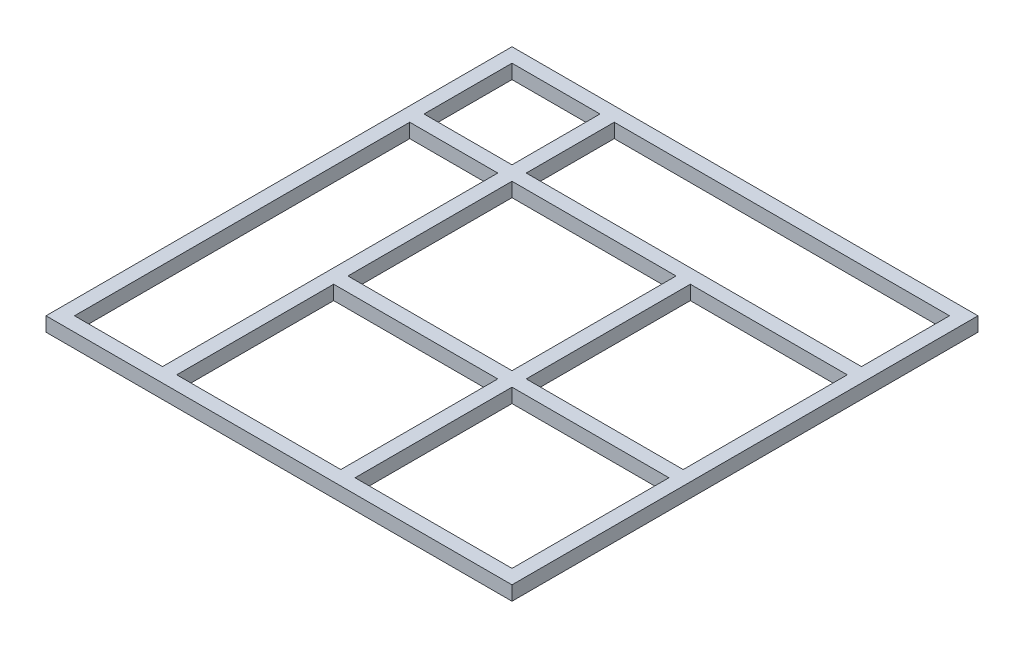
ISO-10303-21;
HEADER;
FILE_DESCRIPTION(('STEP AP214'),'2;1');
FILE_NAME('part.step','',(''),(''),'','','');
FILE_SCHEMA(('AUTOMOTIVE_DESIGN { 1 0 10303 214 1 1 1 1 }'));
ENDSEC;
DATA;
#1=APPLICATION_CONTEXT('core data for automotive mechanical design processes');
#2=APPLICATION_PROTOCOL_DEFINITION('international standard','automotive_design',2000,#1);
#3=PRODUCT_CONTEXT('',#1,'mechanical');
#4=PRODUCT('Part','Part','',(#3));
#5=PRODUCT_RELATED_PRODUCT_CATEGORY('part','',(#4));
#6=PRODUCT_DEFINITION_FORMATION('','',#4);
#7=PRODUCT_DEFINITION_CONTEXT('part definition',#1,'design');
#8=PRODUCT_DEFINITION('design','',#6,#7);
#9=PRODUCT_DEFINITION_SHAPE('','',#8);
#10=(LENGTH_UNIT() NAMED_UNIT(*) SI_UNIT(.MILLI.,.METRE.));
#11=(NAMED_UNIT(*) PLANE_ANGLE_UNIT() SI_UNIT($,.RADIAN.));
#12=(NAMED_UNIT(*) SI_UNIT($,.STERADIAN.) SOLID_ANGLE_UNIT());
#13=UNCERTAINTY_MEASURE_WITH_UNIT(LENGTH_MEASURE(1.E-05),#10,'distance_accuracy_value','');
#14=(GEOMETRIC_REPRESENTATION_CONTEXT(3) GLOBAL_UNCERTAINTY_ASSIGNED_CONTEXT((#13)) GLOBAL_UNIT_ASSIGNED_CONTEXT((#10,
#11,#12)) REPRESENTATION_CONTEXT('',''));
#15=CARTESIAN_POINT('',(0.,0.,0.));
#16=DIRECTION('',(0.,0.,1.));
#17=DIRECTION('',(1.,0.,0.));
#18=AXIS2_PLACEMENT_3D('',#15,#16,#17);
#19=CARTESIAN_POINT('',(0.,13.022,0.));
#20=DIRECTION('',(0.,-1.,0.));
#21=DIRECTION('',(0.,0.,-1.));
#22=AXIS2_PLACEMENT_3D('',#19,#20,#21);
#23=PLANE('',#22);
#24=DIRECTION('',(0.,0.,-1.));
#25=VECTOR('',#24,1.);
#26=CARTESIAN_POINT('',(413.022,13.022,-169.533));
#27=LINE('',#26,#25);
#28=CARTESIAN_POINT('',(413.022,13.022,-169.533));
#29=VERTEX_POINT('',#28);
#30=CARTESIAN_POINT('',(413.022,13.022,-319.533));
#31=VERTEX_POINT('',#30);
#32=EDGE_CURVE('E281',#29,#31,#27,.T.);
#33=ORIENTED_EDGE('',*,*,#32,.F.);
#34=DIRECTION('',(1.,0.,0.));
#35=VECTOR('',#34,1.);
#36=CARTESIAN_POINT('',(269.533,13.022,-169.533));
#37=LINE('',#36,#35);
#38=CARTESIAN_POINT('',(269.533,13.022,-169.533));
#39=VERTEX_POINT('',#38);
#40=EDGE_CURVE('E289',#39,#29,#37,.T.);
#41=ORIENTED_EDGE('',*,*,#40,.F.);
#42=DIRECTION('',(0.,0.,1.));
#43=VECTOR('',#42,1.);
#44=CARTESIAN_POINT('',(269.533,13.022,-319.533));
#45=LINE('',#44,#43);
#46=CARTESIAN_POINT('',(269.533,13.022,-319.533));
#47=VERTEX_POINT('',#46);
#48=EDGE_CURVE('E286',#47,#39,#45,.T.);
#49=ORIENTED_EDGE('',*,*,#48,.F.);
#50=DIRECTION('',(-1.,0.,0.));
#51=VECTOR('',#50,1.);
#52=CARTESIAN_POINT('',(269.533,13.022,-319.533));
#53=LINE('',#52,#51);
#54=EDGE_CURVE('E283',#31,#47,#53,.T.);
#55=ORIENTED_EDGE('',*,*,#54,.F.);
#56=EDGE_LOOP('',(#33,#41,#49,#55));
#57=FACE_BOUND('',#56,.T.);
#58=DIRECTION('',(1.,0.,0.));
#59=VECTOR('',#58,1.);
#60=CARTESIAN_POINT('',(269.533,13.022,-13.022));
#61=LINE('',#60,#59);
#62=CARTESIAN_POINT('',(269.533,13.022,-13.022));
#63=VERTEX_POINT('',#62);
#64=CARTESIAN_POINT('',(413.022,13.022,-13.022));
#65=VERTEX_POINT('',#64);
#66=EDGE_CURVE('E343',#63,#65,#61,.T.);
#67=ORIENTED_EDGE('',*,*,#66,.F.);
#68=DIRECTION('',(0.,0.,1.));
#69=VECTOR('',#68,1.);
#70=CARTESIAN_POINT('',(269.533,13.022,-156.511));
#71=LINE('',#70,#69);
#72=CARTESIAN_POINT('',(269.533,13.022,-156.511));
#73=VERTEX_POINT('',#72);
#74=EDGE_CURVE('E351',#73,#63,#71,.T.);
#75=ORIENTED_EDGE('',*,*,#74,.F.);
#76=DIRECTION('',(-1.,0.,0.));
#77=VECTOR('',#76,1.);
#78=CARTESIAN_POINT('',(269.533,13.022,-156.511));
#79=LINE('',#78,#77);
#80=CARTESIAN_POINT('',(413.022,13.022,-156.511));
#81=VERTEX_POINT('',#80);
#82=EDGE_CURVE('E348',#81,#73,#79,.T.);
#83=ORIENTED_EDGE('',*,*,#82,.F.);
#84=DIRECTION('',(0.,0.,-1.));
#85=VECTOR('',#84,1.);
#86=CARTESIAN_POINT('',(413.022,13.022,-13.022));
#87=LINE('',#86,#85);
#88=EDGE_CURVE('E345',#65,#81,#87,.T.);
#89=ORIENTED_EDGE('',*,*,#88,.F.);
#90=EDGE_LOOP('',(#67,#75,#83,#89));
#91=FACE_BOUND('',#90,.T.);
#92=DIRECTION('',(0.,0.,-1.));
#93=VECTOR('',#92,1.);
#94=CARTESIAN_POINT('',(413.022,13.022,-332.555));
#95=LINE('',#94,#93);
#96=CARTESIAN_POINT('',(413.022,13.022,-332.555));
#97=VERTEX_POINT('',#96);
#98=CARTESIAN_POINT('',(413.022,13.022,-413.022));
#99=VERTEX_POINT('',#98);
#100=EDGE_CURVE('E405',#97,#99,#95,.T.);
#101=ORIENTED_EDGE('',*,*,#100,.F.);
#102=DIRECTION('',(1.,0.,0.));
#103=VECTOR('',#102,1.);
#104=CARTESIAN_POINT('',(106.511,13.022,-332.555));
#105=LINE('',#104,#103);
#106=CARTESIAN_POINT('',(106.511,13.022,-332.555));
#107=VERTEX_POINT('',#106);
#108=EDGE_CURVE('E413',#107,#97,#105,.T.);
#109=ORIENTED_EDGE('',*,*,#108,.F.);
#110=DIRECTION('',(0.,0.,1.));
#111=VECTOR('',#110,1.);
#112=CARTESIAN_POINT('',(106.511,13.022,-413.022));
#113=LINE('',#112,#111);
#114=CARTESIAN_POINT('',(106.511,13.022,-413.022));
#115=VERTEX_POINT('',#114);
#116=EDGE_CURVE('E410',#115,#107,#113,.T.);
#117=ORIENTED_EDGE('',*,*,#116,.F.);
#118=DIRECTION('',(-1.,0.,0.));
#119=VECTOR('',#118,1.);
#120=CARTESIAN_POINT('',(106.511,13.022,-413.022));
#121=LINE('',#120,#119);
#122=EDGE_CURVE('E407',#99,#115,#121,.T.);
#123=ORIENTED_EDGE('',*,*,#122,.F.);
#124=EDGE_LOOP('',(#101,#109,#117,#123));
#125=FACE_BOUND('',#124,.T.);
#126=DIRECTION('',(0.,0.,1.));
#127=VECTOR('',#126,1.);
#128=CARTESIAN_POINT('',(0.,13.022,0.));
#129=LINE('',#128,#127);
#130=CARTESIAN_POINT('',(0.,13.022,-426.044));
#131=VERTEX_POINT('',#130);
#132=CARTESIAN_POINT('',(0.,13.022,0.));
#133=VERTEX_POINT('',#132);
#134=EDGE_CURVE('E467',#131,#133,#129,.T.);
#135=ORIENTED_EDGE('',*,*,#134,.T.);
#136=DIRECTION('',(1.,0.,0.));
#137=VECTOR('',#136,1.);
#138=CARTESIAN_POINT('',(0.,13.022,0.));
#139=LINE('',#138,#137);
#140=CARTESIAN_POINT('',(426.044,13.022,0.));
#141=VERTEX_POINT('',#140);
#142=EDGE_CURVE('E470',#133,#141,#139,.T.);
#143=ORIENTED_EDGE('',*,*,#142,.T.);
#144=DIRECTION('',(0.,0.,-1.));
#145=VECTOR('',#144,1.);
#146=CARTESIAN_POINT('',(426.044,13.022,0.));
#147=LINE('',#146,#145);
#148=CARTESIAN_POINT('',(426.044,13.022,-426.044));
#149=VERTEX_POINT('',#148);
#150=EDGE_CURVE('E473',#141,#149,#147,.T.);
#151=ORIENTED_EDGE('',*,*,#150,.T.);
#152=DIRECTION('',(-1.,0.,0.));
#153=VECTOR('',#152,1.);
#154=CARTESIAN_POINT('',(0.,13.022,-426.044));
#155=LINE('',#154,#153);
#156=EDGE_CURVE('E475',#149,#131,#155,.T.);
#157=ORIENTED_EDGE('',*,*,#156,.T.);
#158=EDGE_LOOP('',(#135,#143,#151,#157));
#159=FACE_BOUND('',#158,.T.);
#160=DIRECTION('',(0.,0.,1.));
#161=VECTOR('',#160,1.);
#162=CARTESIAN_POINT('',(13.0219999999999,13.022,-13.022));
#163=LINE('',#162,#161);
#164=CARTESIAN_POINT('',(13.0219999999999,13.022,-319.533));
#165=VERTEX_POINT('',#164);
#166=CARTESIAN_POINT('',(13.0219999999999,13.022,-13.022));
#167=VERTEX_POINT('',#166);
#168=EDGE_CURVE('E436',#165,#167,#163,.T.);
#169=ORIENTED_EDGE('',*,*,#168,.F.);
#170=DIRECTION('',(-1.,0.,0.));
#171=VECTOR('',#170,1.);
#172=CARTESIAN_POINT('',(13.0219999999999,13.022,-319.533));
#173=LINE('',#172,#171);
#174=CARTESIAN_POINT('',(93.4890000000026,13.022,-319.533));
#175=VERTEX_POINT('',#174);
#176=EDGE_CURVE('E444',#175,#165,#173,.T.);
#177=ORIENTED_EDGE('',*,*,#176,.F.);
#178=DIRECTION('',(0.,0.,-1.));
#179=VECTOR('',#178,1.);
#180=CARTESIAN_POINT('',(93.4890000000026,13.022,-319.533));
#181=LINE('',#180,#179);
#182=CARTESIAN_POINT('',(93.489,13.022,-13.022));
#183=VERTEX_POINT('',#182);
#184=EDGE_CURVE('E441',#183,#175,#181,.T.);
#185=ORIENTED_EDGE('',*,*,#184,.F.);
#186=DIRECTION('',(1.,0.,0.));
#187=VECTOR('',#186,1.);
#188=CARTESIAN_POINT('',(13.0219999999999,13.022,-13.022));
#189=LINE('',#188,#187);
#190=EDGE_CURVE('E438',#167,#183,#189,.T.);
#191=ORIENTED_EDGE('',*,*,#190,.F.);
#192=EDGE_LOOP('',(#169,#177,#185,#191));
#193=FACE_BOUND('',#192,.T.);
#194=DIRECTION('',(0.,0.,1.));
#195=VECTOR('',#194,1.);
#196=CARTESIAN_POINT('',(13.0219999999999,13.022,-332.555));
#197=LINE('',#196,#195);
#198=CARTESIAN_POINT('',(13.0219999999999,13.022,-413.022));
#199=VERTEX_POINT('',#198);
#200=CARTESIAN_POINT('',(13.0219999999999,13.022,-332.555));
#201=VERTEX_POINT('',#200);
#202=EDGE_CURVE('E374',#199,#201,#197,.T.);
#203=ORIENTED_EDGE('',*,*,#202,.F.);
#204=DIRECTION('',(-1.,0.,0.));
#205=VECTOR('',#204,1.);
#206=CARTESIAN_POINT('',(13.0219999999999,13.022,-413.022));
#207=LINE('',#206,#205);
#208=CARTESIAN_POINT('',(93.489,13.022,-413.022));
#209=VERTEX_POINT('',#208);
#210=EDGE_CURVE('E382',#209,#199,#207,.T.);
#211=ORIENTED_EDGE('',*,*,#210,.F.);
#212=DIRECTION('',(0.,0.,-1.));
#213=VECTOR('',#212,1.);
#214=CARTESIAN_POINT('',(93.489,13.022,-413.022));
#215=LINE('',#214,#213);
#216=CARTESIAN_POINT('',(93.489,13.022,-332.555));
#217=VERTEX_POINT('',#216);
#218=EDGE_CURVE('E379',#217,#209,#215,.T.);
#219=ORIENTED_EDGE('',*,*,#218,.F.);
#220=DIRECTION('',(1.,0.,0.));
#221=VECTOR('',#220,1.);
#222=CARTESIAN_POINT('',(13.0219999999999,13.022,-332.555));
#223=LINE('',#222,#221);
#224=EDGE_CURVE('E376',#201,#217,#223,.T.);
#225=ORIENTED_EDGE('',*,*,#224,.F.);
#226=EDGE_LOOP('',(#203,#211,#219,#225));
#227=FACE_BOUND('',#226,.T.);
#228=DIRECTION('',(0.,0.,1.));
#229=VECTOR('',#228,1.);
#230=CARTESIAN_POINT('',(106.511,13.022,-156.511));
#231=LINE('',#230,#229);
#232=CARTESIAN_POINT('',(106.511,13.022,-156.511));
#233=VERTEX_POINT('',#232);
#234=CARTESIAN_POINT('',(106.511,13.022,-13.022));
#235=VERTEX_POINT('',#234);
#236=EDGE_CURVE('E312',#233,#235,#231,.T.);
#237=ORIENTED_EDGE('',*,*,#236,.F.);
#238=DIRECTION('',(-1.,0.,0.));
#239=VECTOR('',#238,1.);
#240=CARTESIAN_POINT('',(106.511,13.022,-156.511));
#241=LINE('',#240,#239);
#242=CARTESIAN_POINT('',(256.511,13.022,-156.511));
#243=VERTEX_POINT('',#242);
#244=EDGE_CURVE('E320',#243,#233,#241,.T.);
#245=ORIENTED_EDGE('',*,*,#244,.F.);
#246=DIRECTION('',(0.,0.,-1.));
#247=VECTOR('',#246,1.);
#248=CARTESIAN_POINT('',(256.511,13.022,-156.511));
#249=LINE('',#248,#247);
#250=CARTESIAN_POINT('',(256.511,13.022,-13.022));
#251=VERTEX_POINT('',#250);
#252=EDGE_CURVE('E317',#251,#243,#249,.T.);
#253=ORIENTED_EDGE('',*,*,#252,.F.);
#254=DIRECTION('',(1.,0.,0.));
#255=VECTOR('',#254,1.);
#256=CARTESIAN_POINT('',(106.511,13.022,-13.022));
#257=LINE('',#256,#255);
#258=EDGE_CURVE('E314',#235,#251,#257,.T.);
#259=ORIENTED_EDGE('',*,*,#258,.F.);
#260=EDGE_LOOP('',(#237,#245,#253,#259));
#261=FACE_BOUND('',#260,.T.);
#262=DIRECTION('',(0.,0.,-1.));
#263=VECTOR('',#262,1.);
#264=CARTESIAN_POINT('',(256.511,13.022,-319.533));
#265=LINE('',#264,#263);
#266=CARTESIAN_POINT('',(256.511,13.022,-169.533));
#267=VERTEX_POINT('',#266);
#268=CARTESIAN_POINT('',(256.511,13.022,-319.533));
#269=VERTEX_POINT('',#268);
#270=EDGE_CURVE('E245',#267,#269,#265,.T.);
#271=ORIENTED_EDGE('',*,*,#270,.F.);
#272=DIRECTION('',(1.,0.,0.));
#273=VECTOR('',#272,1.);
#274=CARTESIAN_POINT('',(106.511,13.022,-169.533));
#275=LINE('',#274,#273);
#276=CARTESIAN_POINT('',(106.511,13.022,-169.533));
#277=VERTEX_POINT('',#276);
#278=EDGE_CURVE('E267',#277,#267,#275,.T.);
#279=ORIENTED_EDGE('',*,*,#278,.F.);
#280=DIRECTION('',(0.,0.,1.));
#281=VECTOR('',#280,1.);
#282=CARTESIAN_POINT('',(106.511,13.022,-319.533000000003));
#283=LINE('',#282,#281);
#284=CARTESIAN_POINT('',(106.511,13.022,-319.533000000003));
#285=VERTEX_POINT('',#284);
#286=EDGE_CURVE('E265',#285,#277,#283,.T.);
#287=ORIENTED_EDGE('',*,*,#286,.F.);
#288=DIRECTION('',(-1.,0.,0.));
#289=VECTOR('',#288,1.);
#290=CARTESIAN_POINT('',(106.511,13.022,-319.533000000003));
#291=LINE('',#290,#289);
#292=EDGE_CURVE('E253',#269,#285,#291,.T.);
#293=ORIENTED_EDGE('',*,*,#292,.F.);
#294=EDGE_LOOP('',(#271,#279,#287,#293));
#295=FACE_BOUND('',#294,.T.);
#296=ADVANCED_FACE('F36',(#57,#91,#125,#159,#193,#227,#261,#295),#23,.F.);
#297=CARTESIAN_POINT('',(0.,0.,0.));
#298=DIRECTION('',(0.,-1.,0.));
#299=DIRECTION('',(0.,0.,-1.));
#300=AXIS2_PLACEMENT_3D('',#297,#298,#299);
#301=PLANE('',#300);
#302=DIRECTION('',(0.,0.,1.));
#303=VECTOR('',#302,1.);
#304=CARTESIAN_POINT('',(0.,0.,0.));
#305=LINE('',#304,#303);
#306=CARTESIAN_POINT('',(0.,0.,-426.044));
#307=VERTEX_POINT('',#306);
#308=CARTESIAN_POINT('',(0.,0.,0.));
#309=VERTEX_POINT('',#308);
#310=EDGE_CURVE('E466',#307,#309,#305,.T.);
#311=ORIENTED_EDGE('',*,*,#310,.F.);
#312=DIRECTION('',(-1.,0.,0.));
#313=VECTOR('',#312,1.);
#314=CARTESIAN_POINT('',(0.,0.,-426.044));
#315=LINE('',#314,#313);
#316=CARTESIAN_POINT('',(426.044,0.,-426.044));
#317=VERTEX_POINT('',#316);
#318=EDGE_CURVE('E471',#317,#307,#315,.T.);
#319=ORIENTED_EDGE('',*,*,#318,.F.);
#320=DIRECTION('',(0.,0.,-1.));
#321=VECTOR('',#320,1.);
#322=CARTESIAN_POINT('',(426.044,0.,0.));
#323=LINE('',#322,#321);
#324=CARTESIAN_POINT('',(426.044,0.,0.));
#325=VERTEX_POINT('',#324);
#326=EDGE_CURVE('E482',#325,#317,#323,.T.);
#327=ORIENTED_EDGE('',*,*,#326,.F.);
#328=DIRECTION('',(1.,0.,0.));
#329=VECTOR('',#328,1.);
#330=CARTESIAN_POINT('',(0.,0.,0.));
#331=LINE('',#330,#329);
#332=EDGE_CURVE('E480',#309,#325,#331,.T.);
#333=ORIENTED_EDGE('',*,*,#332,.F.);
#334=EDGE_LOOP('',(#311,#319,#327,#333));
#335=FACE_BOUND('',#334,.T.);
#336=DIRECTION('',(-1.,0.,0.));
#337=VECTOR('',#336,1.);
#338=CARTESIAN_POINT('',(13.0219999999999,0.,-319.533));
#339=LINE('',#338,#337);
#340=CARTESIAN_POINT('',(93.4890000000026,0.,-319.533));
#341=VERTEX_POINT('',#340);
#342=CARTESIAN_POINT('',(13.0219999999999,0.,-319.533));
#343=VERTEX_POINT('',#342);
#344=EDGE_CURVE('E439',#341,#343,#339,.T.);
#345=ORIENTED_EDGE('',*,*,#344,.T.);
#346=DIRECTION('',(0.,0.,1.));
#347=VECTOR('',#346,1.);
#348=CARTESIAN_POINT('',(13.0219999999999,0.,-13.022));
#349=LINE('',#348,#347);
#350=CARTESIAN_POINT('',(13.0219999999999,0.,-13.022));
#351=VERTEX_POINT('',#350);
#352=EDGE_CURVE('E435',#343,#351,#349,.T.);
#353=ORIENTED_EDGE('',*,*,#352,.T.);
#354=DIRECTION('',(1.,0.,0.));
#355=VECTOR('',#354,1.);
#356=CARTESIAN_POINT('',(13.0219999999999,0.,-13.022));
#357=LINE('',#356,#355);
#358=CARTESIAN_POINT('',(93.489,0.,-13.022));
#359=VERTEX_POINT('',#358);
#360=EDGE_CURVE('E449',#351,#359,#357,.T.);
#361=ORIENTED_EDGE('',*,*,#360,.T.);
#362=DIRECTION('',(0.,0.,-1.));
#363=VECTOR('',#362,1.);
#364=CARTESIAN_POINT('',(93.4890000000026,0.,-319.533));
#365=LINE('',#364,#363);
#366=EDGE_CURVE('E452',#359,#341,#365,.T.);
#367=ORIENTED_EDGE('',*,*,#366,.T.);
#368=EDGE_LOOP('',(#345,#353,#361,#367));
#369=FACE_BOUND('',#368,.T.);
#370=DIRECTION('',(1.,0.,0.));
#371=VECTOR('',#370,1.);
#372=CARTESIAN_POINT('',(106.511,0.,-332.555));
#373=LINE('',#372,#371);
#374=CARTESIAN_POINT('',(106.511,0.,-332.555));
#375=VERTEX_POINT('',#374);
#376=CARTESIAN_POINT('',(413.022,0.,-332.555));
#377=VERTEX_POINT('',#376);
#378=EDGE_CURVE('E408',#375,#377,#373,.T.);
#379=ORIENTED_EDGE('',*,*,#378,.T.);
#380=DIRECTION('',(0.,0.,-1.));
#381=VECTOR('',#380,1.);
#382=CARTESIAN_POINT('',(413.022,0.,-332.555));
#383=LINE('',#382,#381);
#384=CARTESIAN_POINT('',(413.022,0.,-413.022));
#385=VERTEX_POINT('',#384);
#386=EDGE_CURVE('E404',#377,#385,#383,.T.);
#387=ORIENTED_EDGE('',*,*,#386,.T.);
#388=DIRECTION('',(-1.,0.,0.));
#389=VECTOR('',#388,1.);
#390=CARTESIAN_POINT('',(106.511,0.,-413.022));
#391=LINE('',#390,#389);
#392=CARTESIAN_POINT('',(106.511,0.,-413.022));
#393=VERTEX_POINT('',#392);
#394=EDGE_CURVE('E418',#385,#393,#391,.T.);
#395=ORIENTED_EDGE('',*,*,#394,.T.);
#396=DIRECTION('',(0.,0.,1.));
#397=VECTOR('',#396,1.);
#398=CARTESIAN_POINT('',(106.511,0.,-413.022));
#399=LINE('',#398,#397);
#400=EDGE_CURVE('E421',#393,#375,#399,.T.);
#401=ORIENTED_EDGE('',*,*,#400,.T.);
#402=EDGE_LOOP('',(#379,#387,#395,#401));
#403=FACE_BOUND('',#402,.T.);
#404=DIRECTION('',(-1.,0.,0.));
#405=VECTOR('',#404,1.);
#406=CARTESIAN_POINT('',(13.0219999999999,0.,-413.022));
#407=LINE('',#406,#405);
#408=CARTESIAN_POINT('',(93.489,0.,-413.022));
#409=VERTEX_POINT('',#408);
#410=CARTESIAN_POINT('',(13.0219999999999,0.,-413.022));
#411=VERTEX_POINT('',#410);
#412=EDGE_CURVE('E377',#409,#411,#407,.T.);
#413=ORIENTED_EDGE('',*,*,#412,.T.);
#414=DIRECTION('',(0.,0.,1.));
#415=VECTOR('',#414,1.);
#416=CARTESIAN_POINT('',(13.0219999999999,0.,-332.555));
#417=LINE('',#416,#415);
#418=CARTESIAN_POINT('',(13.0219999999999,0.,-332.555));
#419=VERTEX_POINT('',#418);
#420=EDGE_CURVE('E373',#411,#419,#417,.T.);
#421=ORIENTED_EDGE('',*,*,#420,.T.);
#422=DIRECTION('',(1.,0.,0.));
#423=VECTOR('',#422,1.);
#424=CARTESIAN_POINT('',(13.0219999999999,0.,-332.555));
#425=LINE('',#424,#423);
#426=CARTESIAN_POINT('',(93.489,0.,-332.555));
#427=VERTEX_POINT('',#426);
#428=EDGE_CURVE('E387',#419,#427,#425,.T.);
#429=ORIENTED_EDGE('',*,*,#428,.T.);
#430=DIRECTION('',(0.,0.,-1.));
#431=VECTOR('',#430,1.);
#432=CARTESIAN_POINT('',(93.489,0.,-413.022));
#433=LINE('',#432,#431);
#434=EDGE_CURVE('E390',#427,#409,#433,.T.);
#435=ORIENTED_EDGE('',*,*,#434,.T.);
#436=EDGE_LOOP('',(#413,#421,#429,#435));
#437=FACE_BOUND('',#436,.T.);
#438=DIRECTION('',(0.,0.,1.));
#439=VECTOR('',#438,1.);
#440=CARTESIAN_POINT('',(269.533,0.,-156.511));
#441=LINE('',#440,#439);
#442=CARTESIAN_POINT('',(269.533,0.,-156.511));
#443=VERTEX_POINT('',#442);
#444=CARTESIAN_POINT('',(269.533,0.,-13.022));
#445=VERTEX_POINT('',#444);
#446=EDGE_CURVE('E346',#443,#445,#441,.T.);
#447=ORIENTED_EDGE('',*,*,#446,.T.);
#448=DIRECTION('',(1.,0.,0.));
#449=VECTOR('',#448,1.);
#450=CARTESIAN_POINT('',(269.533,0.,-13.022));
#451=LINE('',#450,#449);
#452=CARTESIAN_POINT('',(413.022,0.,-13.022));
#453=VERTEX_POINT('',#452);
#454=EDGE_CURVE('E342',#445,#453,#451,.T.);
#455=ORIENTED_EDGE('',*,*,#454,.T.);
#456=DIRECTION('',(0.,0.,-1.));
#457=VECTOR('',#456,1.);
#458=CARTESIAN_POINT('',(413.022,0.,-13.022));
#459=LINE('',#458,#457);
#460=CARTESIAN_POINT('',(413.022,0.,-156.511));
#461=VERTEX_POINT('',#460);
#462=EDGE_CURVE('E356',#453,#461,#459,.T.);
#463=ORIENTED_EDGE('',*,*,#462,.T.);
#464=DIRECTION('',(-1.,0.,0.));
#465=VECTOR('',#464,1.);
#466=CARTESIAN_POINT('',(269.533,0.,-156.511));
#467=LINE('',#466,#465);
#468=EDGE_CURVE('E359',#461,#443,#467,.T.);
#469=ORIENTED_EDGE('',*,*,#468,.T.);
#470=EDGE_LOOP('',(#447,#455,#463,#469));
#471=FACE_BOUND('',#470,.T.);
#472=DIRECTION('',(-1.,0.,0.));
#473=VECTOR('',#472,1.);
#474=CARTESIAN_POINT('',(106.511,0.,-156.511));
#475=LINE('',#474,#473);
#476=CARTESIAN_POINT('',(256.511,0.,-156.511));
#477=VERTEX_POINT('',#476);
#478=CARTESIAN_POINT('',(106.511,0.,-156.511));
#479=VERTEX_POINT('',#478);
#480=EDGE_CURVE('E315',#477,#479,#475,.T.);
#481=ORIENTED_EDGE('',*,*,#480,.T.);
#482=DIRECTION('',(0.,0.,1.));
#483=VECTOR('',#482,1.);
#484=CARTESIAN_POINT('',(106.511,0.,-156.511));
#485=LINE('',#484,#483);
#486=CARTESIAN_POINT('',(106.511,0.,-13.022));
#487=VERTEX_POINT('',#486);
#488=EDGE_CURVE('E311',#479,#487,#485,.T.);
#489=ORIENTED_EDGE('',*,*,#488,.T.);
#490=DIRECTION('',(1.,0.,0.));
#491=VECTOR('',#490,1.);
#492=CARTESIAN_POINT('',(106.511,0.,-13.022));
#493=LINE('',#492,#491);
#494=CARTESIAN_POINT('',(256.511,0.,-13.022));
#495=VERTEX_POINT('',#494);
#496=EDGE_CURVE('E325',#487,#495,#493,.T.);
#497=ORIENTED_EDGE('',*,*,#496,.T.);
#498=DIRECTION('',(0.,0.,-1.));
#499=VECTOR('',#498,1.);
#500=CARTESIAN_POINT('',(256.511,0.,-156.511));
#501=LINE('',#500,#499);
#502=EDGE_CURVE('E328',#495,#477,#501,.T.);
#503=ORIENTED_EDGE('',*,*,#502,.T.);
#504=EDGE_LOOP('',(#481,#489,#497,#503));
#505=FACE_BOUND('',#504,.T.);
#506=DIRECTION('',(1.,0.,0.));
#507=VECTOR('',#506,1.);
#508=CARTESIAN_POINT('',(269.533,0.,-169.533));
#509=LINE('',#508,#507);
#510=CARTESIAN_POINT('',(269.533,0.,-169.533));
#511=VERTEX_POINT('',#510);
#512=CARTESIAN_POINT('',(413.022,0.,-169.533));
#513=VERTEX_POINT('',#512);
#514=EDGE_CURVE('E284',#511,#513,#509,.T.);
#515=ORIENTED_EDGE('',*,*,#514,.T.);
#516=DIRECTION('',(0.,0.,-1.));
#517=VECTOR('',#516,1.);
#518=CARTESIAN_POINT('',(413.022,0.,-169.533));
#519=LINE('',#518,#517);
#520=CARTESIAN_POINT('',(413.022,0.,-319.533));
#521=VERTEX_POINT('',#520);
#522=EDGE_CURVE('E261',#513,#521,#519,.T.);
#523=ORIENTED_EDGE('',*,*,#522,.T.);
#524=DIRECTION('',(-1.,0.,0.));
#525=VECTOR('',#524,1.);
#526=CARTESIAN_POINT('',(269.533,0.,-319.533));
#527=LINE('',#526,#525);
#528=CARTESIAN_POINT('',(269.533,0.,-319.533));
#529=VERTEX_POINT('',#528);
#530=EDGE_CURVE('E294',#521,#529,#527,.T.);
#531=ORIENTED_EDGE('',*,*,#530,.T.);
#532=DIRECTION('',(0.,0.,1.));
#533=VECTOR('',#532,1.);
#534=CARTESIAN_POINT('',(269.533,0.,-319.533));
#535=LINE('',#534,#533);
#536=EDGE_CURVE('E297',#529,#511,#535,.T.);
#537=ORIENTED_EDGE('',*,*,#536,.T.);
#538=EDGE_LOOP('',(#515,#523,#531,#537));
#539=FACE_BOUND('',#538,.T.);
#540=DIRECTION('',(1.,0.,0.));
#541=VECTOR('',#540,1.);
#542=CARTESIAN_POINT('',(106.511,0.,-169.533));
#543=LINE('',#542,#541);
#544=CARTESIAN_POINT('',(106.511,0.,-169.533));
#545=VERTEX_POINT('',#544);
#546=CARTESIAN_POINT('',(256.511,0.,-169.533));
#547=VERTEX_POINT('',#546);
#548=EDGE_CURVE('E254',#545,#547,#543,.T.);
#549=ORIENTED_EDGE('',*,*,#548,.T.);
#550=DIRECTION('',(0.,0.,-1.));
#551=VECTOR('',#550,1.);
#552=CARTESIAN_POINT('',(256.511,0.,-319.533));
#553=LINE('',#552,#551);
#554=CARTESIAN_POINT('',(256.511,0.,-319.533));
#555=VERTEX_POINT('',#554);
#556=EDGE_CURVE('E59',#547,#555,#553,.T.);
#557=ORIENTED_EDGE('',*,*,#556,.T.);
#558=DIRECTION('',(-1.,0.,0.));
#559=VECTOR('',#558,1.);
#560=CARTESIAN_POINT('',(106.511,0.,-319.533000000003));
#561=LINE('',#560,#559);
#562=CARTESIAN_POINT('',(106.511,0.,-319.533000000003));
#563=VERTEX_POINT('',#562);
#564=EDGE_CURVE('E260',#555,#563,#561,.T.);
#565=ORIENTED_EDGE('',*,*,#564,.T.);
#566=DIRECTION('',(0.,0.,1.));
#567=VECTOR('',#566,1.);
#568=CARTESIAN_POINT('',(106.511,0.,-319.533000000003));
#569=LINE('',#568,#567);
#570=EDGE_CURVE('E273',#563,#545,#569,.T.);
#571=ORIENTED_EDGE('',*,*,#570,.T.);
#572=EDGE_LOOP('',(#549,#557,#565,#571));
#573=FACE_BOUND('',#572,.T.);
#574=ADVANCED_FACE('F500',(#335,#369,#403,#437,#471,#505,#539,#573),#301,.T.);
#575=CARTESIAN_POINT('',(0.,13.022,0.));
#576=DIRECTION('',(1.,0.,0.));
#577=DIRECTION('',(0.,0.,-1.));
#578=AXIS2_PLACEMENT_3D('',#575,#576,#577);
#579=PLANE('',#578);
#580=ORIENTED_EDGE('',*,*,#310,.T.);
#581=DIRECTION('',(0.,-1.,0.));
#582=VECTOR('',#581,1.);
#583=CARTESIAN_POINT('',(0.,13.022,0.));
#584=LINE('',#583,#582);
#585=EDGE_CURVE('E11',#133,#309,#584,.T.);
#586=ORIENTED_EDGE('',*,*,#585,.F.);
#587=ORIENTED_EDGE('',*,*,#134,.F.);
#588=DIRECTION('',(0.,-1.,0.));
#589=VECTOR('',#588,1.);
#590=CARTESIAN_POINT('',(0.,13.022,-426.044));
#591=LINE('',#590,#589);
#592=EDGE_CURVE('E477',#131,#307,#591,.T.);
#593=ORIENTED_EDGE('',*,*,#592,.T.);
#594=EDGE_LOOP('',(#580,#586,#587,#593));
#595=FACE_BOUND('',#594,.T.);
#596=ADVANCED_FACE('F38',(#595),#579,.F.);
#597=CARTESIAN_POINT('',(0.,13.022,0.));
#598=DIRECTION('',(0.,0.,-1.));
#599=DIRECTION('',(-1.,0.,0.));
#600=AXIS2_PLACEMENT_3D('',#597,#598,#599);
#601=PLANE('',#600);
#602=ORIENTED_EDGE('',*,*,#332,.T.);
#603=DIRECTION('',(0.,-1.,0.));
#604=VECTOR('',#603,1.);
#605=CARTESIAN_POINT('',(426.044,13.022,0.));
#606=LINE('',#605,#604);
#607=EDGE_CURVE('E44',#141,#325,#606,.T.);
#608=ORIENTED_EDGE('',*,*,#607,.F.);
#609=ORIENTED_EDGE('',*,*,#142,.F.);
#610=ORIENTED_EDGE('',*,*,#585,.T.);
#611=EDGE_LOOP('',(#602,#608,#609,#610));
#612=FACE_BOUND('',#611,.T.);
#613=ADVANCED_FACE('F511',(#612),#601,.F.);
#614=CARTESIAN_POINT('',(426.044,13.022,0.));
#615=DIRECTION('',(-1.,0.,0.));
#616=DIRECTION('',(0.,0.,1.));
#617=AXIS2_PLACEMENT_3D('',#614,#615,#616);
#618=PLANE('',#617);
#619=ORIENTED_EDGE('',*,*,#326,.T.);
#620=DIRECTION('',(0.,-1.,0.));
#621=VECTOR('',#620,1.);
#622=CARTESIAN_POINT('',(426.044,13.022,-426.044));
#623=LINE('',#622,#621);
#624=EDGE_CURVE('E487',#149,#317,#623,.T.);
#625=ORIENTED_EDGE('',*,*,#624,.F.);
#626=ORIENTED_EDGE('',*,*,#150,.F.);
#627=ORIENTED_EDGE('',*,*,#607,.T.);
#628=EDGE_LOOP('',(#619,#625,#626,#627));
#629=FACE_BOUND('',#628,.T.);
#630=ADVANCED_FACE('F494',(#629),#618,.F.);
#631=CARTESIAN_POINT('',(0.,13.022,-426.044));
#632=DIRECTION('',(0.,0.,1.));
#633=DIRECTION('',(1.,0.,0.));
#634=AXIS2_PLACEMENT_3D('',#631,#632,#633);
#635=PLANE('',#634);
#636=ORIENTED_EDGE('',*,*,#318,.T.);
#637=ORIENTED_EDGE('',*,*,#592,.F.);
#638=ORIENTED_EDGE('',*,*,#156,.F.);
#639=ORIENTED_EDGE('',*,*,#624,.T.);
#640=EDGE_LOOP('',(#636,#637,#638,#639));
#641=FACE_BOUND('',#640,.T.);
#642=ADVANCED_FACE('F504',(#641),#635,.F.);
#643=CARTESIAN_POINT('',(13.0219999999999,13.022,-13.022));
#644=DIRECTION('',(1.,0.,0.));
#645=DIRECTION('',(0.,0.,-1.));
#646=AXIS2_PLACEMENT_3D('',#643,#644,#645);
#647=PLANE('',#646);
#648=ORIENTED_EDGE('',*,*,#352,.F.);
#649=DIRECTION('',(0.,-1.,0.));
#650=VECTOR('',#649,1.);
#651=CARTESIAN_POINT('',(13.0219999999999,13.022,-319.533));
#652=LINE('',#651,#650);
#653=EDGE_CURVE('E446',#165,#343,#652,.T.);
#654=ORIENTED_EDGE('',*,*,#653,.F.);
#655=ORIENTED_EDGE('',*,*,#168,.T.);
#656=DIRECTION('',(0.,-1.,0.));
#657=VECTOR('',#656,1.);
#658=CARTESIAN_POINT('',(13.0219999999999,13.022,-13.022));
#659=LINE('',#658,#657);
#660=EDGE_CURVE('E463',#167,#351,#659,.T.);
#661=ORIENTED_EDGE('',*,*,#660,.T.);
#662=EDGE_LOOP('',(#648,#654,#655,#661));
#663=FACE_BOUND('',#662,.T.);
#664=ADVANCED_FACE('F528',(#663),#647,.T.);
#665=CARTESIAN_POINT('',(13.0219999999999,13.022,-13.022));
#666=DIRECTION('',(0.,0.,-1.));
#667=DIRECTION('',(-1.,0.,0.));
#668=AXIS2_PLACEMENT_3D('',#665,#666,#667);
#669=PLANE('',#668);
#670=ORIENTED_EDGE('',*,*,#360,.F.);
#671=ORIENTED_EDGE('',*,*,#660,.F.);
#672=ORIENTED_EDGE('',*,*,#190,.T.);
#673=DIRECTION('',(0.,-1.,0.));
#674=VECTOR('',#673,1.);
#675=CARTESIAN_POINT('',(93.489,13.022,-13.022));
#676=LINE('',#675,#674);
#677=EDGE_CURVE('E461',#183,#359,#676,.T.);
#678=ORIENTED_EDGE('',*,*,#677,.T.);
#679=EDGE_LOOP('',(#670,#671,#672,#678));
#680=FACE_BOUND('',#679,.T.);
#681=ADVANCED_FACE('F535',(#680),#669,.T.);
#682=CARTESIAN_POINT('',(93.4890000000026,13.022,-319.533));
#683=DIRECTION('',(-1.,0.,0.));
#684=DIRECTION('',(0.,0.,1.));
#685=AXIS2_PLACEMENT_3D('',#682,#683,#684);
#686=PLANE('',#685);
#687=ORIENTED_EDGE('',*,*,#366,.F.);
#688=ORIENTED_EDGE('',*,*,#677,.F.);
#689=ORIENTED_EDGE('',*,*,#184,.T.);
#690=DIRECTION('',(0.,-1.,0.));
#691=VECTOR('',#690,1.);
#692=CARTESIAN_POINT('',(93.4890000000026,13.022,-319.533));
#693=LINE('',#692,#691);
#694=EDGE_CURVE('E459',#175,#341,#693,.T.);
#695=ORIENTED_EDGE('',*,*,#694,.T.);
#696=EDGE_LOOP('',(#687,#688,#689,#695));
#697=FACE_BOUND('',#696,.T.);
#698=ADVANCED_FACE('F540',(#697),#686,.T.);
#699=CARTESIAN_POINT('',(13.0219999999999,13.022,-319.533));
#700=DIRECTION('',(0.,0.,1.));
#701=DIRECTION('',(1.,0.,0.));
#702=AXIS2_PLACEMENT_3D('',#699,#700,#701);
#703=PLANE('',#702);
#704=ORIENTED_EDGE('',*,*,#344,.F.);
#705=ORIENTED_EDGE('',*,*,#694,.F.);
#706=ORIENTED_EDGE('',*,*,#176,.T.);
#707=ORIENTED_EDGE('',*,*,#653,.T.);
#708=EDGE_LOOP('',(#704,#705,#706,#707));
#709=FACE_BOUND('',#708,.T.);
#710=ADVANCED_FACE('F547',(#709),#703,.T.);
#711=CARTESIAN_POINT('',(413.022,13.022,-332.555));
#712=DIRECTION('',(-1.,0.,0.));
#713=DIRECTION('',(0.,0.,1.));
#714=AXIS2_PLACEMENT_3D('',#711,#712,#713);
#715=PLANE('',#714);
#716=ORIENTED_EDGE('',*,*,#386,.F.);
#717=DIRECTION('',(0.,-1.,0.));
#718=VECTOR('',#717,1.);
#719=CARTESIAN_POINT('',(413.022,13.022,-332.555));
#720=LINE('',#719,#718);
#721=EDGE_CURVE('E415',#97,#377,#720,.T.);
#722=ORIENTED_EDGE('',*,*,#721,.F.);
#723=ORIENTED_EDGE('',*,*,#100,.T.);
#724=DIRECTION('',(0.,-1.,0.));
#725=VECTOR('',#724,1.);
#726=CARTESIAN_POINT('',(413.022,13.022,-413.022));
#727=LINE('',#726,#725);
#728=EDGE_CURVE('E432',#99,#385,#727,.T.);
#729=ORIENTED_EDGE('',*,*,#728,.T.);
#730=EDGE_LOOP('',(#716,#722,#723,#729));
#731=FACE_BOUND('',#730,.T.);
#732=ADVANCED_FACE('F635',(#731),#715,.T.);
#733=CARTESIAN_POINT('',(106.511,13.022,-413.022));
#734=DIRECTION('',(0.,0.,1.));
#735=DIRECTION('',(1.,0.,0.));
#736=AXIS2_PLACEMENT_3D('',#733,#734,#735);
#737=PLANE('',#736);
#738=ORIENTED_EDGE('',*,*,#394,.F.);
#739=ORIENTED_EDGE('',*,*,#728,.F.);
#740=ORIENTED_EDGE('',*,*,#122,.T.);
#741=DIRECTION('',(0.,-1.,0.));
#742=VECTOR('',#741,1.);
#743=CARTESIAN_POINT('',(106.511,13.022,-413.022));
#744=LINE('',#743,#742);
#745=EDGE_CURVE('E430',#115,#393,#744,.T.);
#746=ORIENTED_EDGE('',*,*,#745,.T.);
#747=EDGE_LOOP('',(#738,#739,#740,#746));
#748=FACE_BOUND('',#747,.T.);
#749=ADVANCED_FACE('F631',(#748),#737,.T.);
#750=CARTESIAN_POINT('',(106.511,13.022,-413.022));
#751=DIRECTION('',(1.,0.,0.));
#752=DIRECTION('',(0.,0.,-1.));
#753=AXIS2_PLACEMENT_3D('',#750,#751,#752);
#754=PLANE('',#753);
#755=ORIENTED_EDGE('',*,*,#400,.F.);
#756=ORIENTED_EDGE('',*,*,#745,.F.);
#757=ORIENTED_EDGE('',*,*,#116,.T.);
#758=DIRECTION('',(0.,-1.,0.));
#759=VECTOR('',#758,1.);
#760=CARTESIAN_POINT('',(106.511,13.022,-332.555));
#761=LINE('',#760,#759);
#762=EDGE_CURVE('E428',#107,#375,#761,.T.);
#763=ORIENTED_EDGE('',*,*,#762,.T.);
#764=EDGE_LOOP('',(#755,#756,#757,#763));
#765=FACE_BOUND('',#764,.T.);
#766=ADVANCED_FACE('F627',(#765),#754,.T.);
#767=CARTESIAN_POINT('',(106.511,13.022,-332.555));
#768=DIRECTION('',(0.,0.,-1.));
#769=DIRECTION('',(-1.,0.,0.));
#770=AXIS2_PLACEMENT_3D('',#767,#768,#769);
#771=PLANE('',#770);
#772=ORIENTED_EDGE('',*,*,#378,.F.);
#773=ORIENTED_EDGE('',*,*,#762,.F.);
#774=ORIENTED_EDGE('',*,*,#108,.T.);
#775=ORIENTED_EDGE('',*,*,#721,.T.);
#776=EDGE_LOOP('',(#772,#773,#774,#775));
#777=FACE_BOUND('',#776,.T.);
#778=ADVANCED_FACE('F623',(#777),#771,.T.);
#779=CARTESIAN_POINT('',(13.0219999999999,13.022,-332.555));
#780=DIRECTION('',(1.,0.,0.));
#781=DIRECTION('',(0.,0.,-1.));
#782=AXIS2_PLACEMENT_3D('',#779,#780,#781);
#783=PLANE('',#782);
#784=ORIENTED_EDGE('',*,*,#420,.F.);
#785=DIRECTION('',(0.,-1.,0.));
#786=VECTOR('',#785,1.);
#787=CARTESIAN_POINT('',(13.0219999999999,13.022,-413.022));
#788=LINE('',#787,#786);
#789=EDGE_CURVE('E384',#199,#411,#788,.T.);
#790=ORIENTED_EDGE('',*,*,#789,.F.);
#791=ORIENTED_EDGE('',*,*,#202,.T.);
#792=DIRECTION('',(0.,-1.,0.));
#793=VECTOR('',#792,1.);
#794=CARTESIAN_POINT('',(13.0219999999999,13.022,-332.555));
#795=LINE('',#794,#793);
#796=EDGE_CURVE('E401',#201,#419,#795,.T.);
#797=ORIENTED_EDGE('',*,*,#796,.T.);
#798=EDGE_LOOP('',(#784,#790,#791,#797));
#799=FACE_BOUND('',#798,.T.);
#800=ADVANCED_FACE('F619',(#799),#783,.T.);
#801=CARTESIAN_POINT('',(13.0219999999999,13.022,-332.555));
#802=DIRECTION('',(0.,0.,-1.));
#803=DIRECTION('',(-1.,0.,0.));
#804=AXIS2_PLACEMENT_3D('',#801,#802,#803);
#805=PLANE('',#804);
#806=ORIENTED_EDGE('',*,*,#428,.F.);
#807=ORIENTED_EDGE('',*,*,#796,.F.);
#808=ORIENTED_EDGE('',*,*,#224,.T.);
#809=DIRECTION('',(0.,-1.,0.));
#810=VECTOR('',#809,1.);
#811=CARTESIAN_POINT('',(93.489,13.022,-332.555));
#812=LINE('',#811,#810);
#813=EDGE_CURVE('E399',#217,#427,#812,.T.);
#814=ORIENTED_EDGE('',*,*,#813,.T.);
#815=EDGE_LOOP('',(#806,#807,#808,#814));
#816=FACE_BOUND('',#815,.T.);
#817=ADVANCED_FACE('F615',(#816),#805,.T.);
#818=CARTESIAN_POINT('',(93.489,13.022,-413.022));
#819=DIRECTION('',(-1.,0.,0.));
#820=DIRECTION('',(0.,0.,1.));
#821=AXIS2_PLACEMENT_3D('',#818,#819,#820);
#822=PLANE('',#821);
#823=ORIENTED_EDGE('',*,*,#434,.F.);
#824=ORIENTED_EDGE('',*,*,#813,.F.);
#825=ORIENTED_EDGE('',*,*,#218,.T.);
#826=DIRECTION('',(0.,-1.,0.));
#827=VECTOR('',#826,1.);
#828=CARTESIAN_POINT('',(93.489,13.022,-413.022));
#829=LINE('',#828,#827);
#830=EDGE_CURVE('E397',#209,#409,#829,.T.);
#831=ORIENTED_EDGE('',*,*,#830,.T.);
#832=EDGE_LOOP('',(#823,#824,#825,#831));
#833=FACE_BOUND('',#832,.T.);
#834=ADVANCED_FACE('F611',(#833),#822,.T.);
#835=CARTESIAN_POINT('',(13.0219999999999,13.022,-413.022));
#836=DIRECTION('',(0.,0.,1.));
#837=DIRECTION('',(1.,0.,0.));
#838=AXIS2_PLACEMENT_3D('',#835,#836,#837);
#839=PLANE('',#838);
#840=ORIENTED_EDGE('',*,*,#412,.F.);
#841=ORIENTED_EDGE('',*,*,#830,.F.);
#842=ORIENTED_EDGE('',*,*,#210,.T.);
#843=ORIENTED_EDGE('',*,*,#789,.T.);
#844=EDGE_LOOP('',(#840,#841,#842,#843));
#845=FACE_BOUND('',#844,.T.);
#846=ADVANCED_FACE('F607',(#845),#839,.T.);
#847=CARTESIAN_POINT('',(269.533,13.022,-13.022));
#848=DIRECTION('',(0.,0.,-1.));
#849=DIRECTION('',(-1.,0.,0.));
#850=AXIS2_PLACEMENT_3D('',#847,#848,#849);
#851=PLANE('',#850);
#852=ORIENTED_EDGE('',*,*,#454,.F.);
#853=DIRECTION('',(0.,-1.,0.));
#854=VECTOR('',#853,1.);
#855=CARTESIAN_POINT('',(269.533,13.022,-13.022));
#856=LINE('',#855,#854);
#857=EDGE_CURVE('E353',#63,#445,#856,.T.);
#858=ORIENTED_EDGE('',*,*,#857,.F.);
#859=ORIENTED_EDGE('',*,*,#66,.T.);
#860=DIRECTION('',(0.,-1.,0.));
#861=VECTOR('',#860,1.);
#862=CARTESIAN_POINT('',(413.022,13.022,-13.022));
#863=LINE('',#862,#861);
#864=EDGE_CURVE('E370',#65,#453,#863,.T.);
#865=ORIENTED_EDGE('',*,*,#864,.T.);
#866=EDGE_LOOP('',(#852,#858,#859,#865));
#867=FACE_BOUND('',#866,.T.);
#868=ADVANCED_FACE('F603',(#867),#851,.T.);
#869=CARTESIAN_POINT('',(413.022,13.022,-13.022));
#870=DIRECTION('',(-1.,0.,0.));
#871=DIRECTION('',(0.,0.,1.));
#872=AXIS2_PLACEMENT_3D('',#869,#870,#871);
#873=PLANE('',#872);
#874=ORIENTED_EDGE('',*,*,#462,.F.);
#875=ORIENTED_EDGE('',*,*,#864,.F.);
#876=ORIENTED_EDGE('',*,*,#88,.T.);
#877=DIRECTION('',(0.,-1.,0.));
#878=VECTOR('',#877,1.);
#879=CARTESIAN_POINT('',(413.022,13.022,-156.511));
#880=LINE('',#879,#878);
#881=EDGE_CURVE('E368',#81,#461,#880,.T.);
#882=ORIENTED_EDGE('',*,*,#881,.T.);
#883=EDGE_LOOP('',(#874,#875,#876,#882));
#884=FACE_BOUND('',#883,.T.);
#885=ADVANCED_FACE('F599',(#884),#873,.T.);
#886=CARTESIAN_POINT('',(269.533,13.022,-156.511));
#887=DIRECTION('',(0.,0.,1.));
#888=DIRECTION('',(1.,0.,0.));
#889=AXIS2_PLACEMENT_3D('',#886,#887,#888);
#890=PLANE('',#889);
#891=ORIENTED_EDGE('',*,*,#468,.F.);
#892=ORIENTED_EDGE('',*,*,#881,.F.);
#893=ORIENTED_EDGE('',*,*,#82,.T.);
#894=DIRECTION('',(0.,-1.,0.));
#895=VECTOR('',#894,1.);
#896=CARTESIAN_POINT('',(269.533,13.022,-156.511));
#897=LINE('',#896,#895);
#898=EDGE_CURVE('E366',#73,#443,#897,.T.);
#899=ORIENTED_EDGE('',*,*,#898,.T.);
#900=EDGE_LOOP('',(#891,#892,#893,#899));
#901=FACE_BOUND('',#900,.T.);
#902=ADVANCED_FACE('F595',(#901),#890,.T.);
#903=CARTESIAN_POINT('',(269.533,13.022,-156.511));
#904=DIRECTION('',(1.,0.,0.));
#905=DIRECTION('',(0.,0.,-1.));
#906=AXIS2_PLACEMENT_3D('',#903,#904,#905);
#907=PLANE('',#906);
#908=ORIENTED_EDGE('',*,*,#446,.F.);
#909=ORIENTED_EDGE('',*,*,#898,.F.);
#910=ORIENTED_EDGE('',*,*,#74,.T.);
#911=ORIENTED_EDGE('',*,*,#857,.T.);
#912=EDGE_LOOP('',(#908,#909,#910,#911));
#913=FACE_BOUND('',#912,.T.);
#914=ADVANCED_FACE('F592',(#913),#907,.T.);
#915=CARTESIAN_POINT('',(106.511,13.022,-156.511));
#916=DIRECTION('',(1.,0.,0.));
#917=DIRECTION('',(0.,0.,-1.));
#918=AXIS2_PLACEMENT_3D('',#915,#916,#917);
#919=PLANE('',#918);
#920=ORIENTED_EDGE('',*,*,#488,.F.);
#921=DIRECTION('',(0.,-1.,0.));
#922=VECTOR('',#921,1.);
#923=CARTESIAN_POINT('',(106.511,13.022,-156.511));
#924=LINE('',#923,#922);
#925=EDGE_CURVE('E322',#233,#479,#924,.T.);
#926=ORIENTED_EDGE('',*,*,#925,.F.);
#927=ORIENTED_EDGE('',*,*,#236,.T.);
#928=DIRECTION('',(0.,-1.,0.));
#929=VECTOR('',#928,1.);
#930=CARTESIAN_POINT('',(106.511,13.022,-13.022));
#931=LINE('',#930,#929);
#932=EDGE_CURVE('E339',#235,#487,#931,.T.);
#933=ORIENTED_EDGE('',*,*,#932,.T.);
#934=EDGE_LOOP('',(#920,#926,#927,#933));
#935=FACE_BOUND('',#934,.T.);
#936=ADVANCED_FACE('F567',(#935),#919,.T.);
#937=CARTESIAN_POINT('',(106.511,13.022,-13.022));
#938=DIRECTION('',(0.,0.,-1.));
#939=DIRECTION('',(-1.,0.,0.));
#940=AXIS2_PLACEMENT_3D('',#937,#938,#939);
#941=PLANE('',#940);
#942=ORIENTED_EDGE('',*,*,#496,.F.);
#943=ORIENTED_EDGE('',*,*,#932,.F.);
#944=ORIENTED_EDGE('',*,*,#258,.T.);
#945=DIRECTION('',(0.,-1.,0.));
#946=VECTOR('',#945,1.);
#947=CARTESIAN_POINT('',(256.511,13.022,-13.022));
#948=LINE('',#947,#946);
#949=EDGE_CURVE('E337',#251,#495,#948,.T.);
#950=ORIENTED_EDGE('',*,*,#949,.T.);
#951=EDGE_LOOP('',(#942,#943,#944,#950));
#952=FACE_BOUND('',#951,.T.);
#953=ADVANCED_FACE('F569',(#952),#941,.T.);
#954=CARTESIAN_POINT('',(256.511,13.022,-156.511));
#955=DIRECTION('',(-1.,0.,0.));
#956=DIRECTION('',(0.,0.,1.));
#957=AXIS2_PLACEMENT_3D('',#954,#955,#956);
#958=PLANE('',#957);
#959=ORIENTED_EDGE('',*,*,#502,.F.);
#960=ORIENTED_EDGE('',*,*,#949,.F.);
#961=ORIENTED_EDGE('',*,*,#252,.T.);
#962=DIRECTION('',(0.,-1.,0.));
#963=VECTOR('',#962,1.);
#964=CARTESIAN_POINT('',(256.511,13.022,-156.511));
#965=LINE('',#964,#963);
#966=EDGE_CURVE('E335',#243,#477,#965,.T.);
#967=ORIENTED_EDGE('',*,*,#966,.T.);
#968=EDGE_LOOP('',(#959,#960,#961,#967));
#969=FACE_BOUND('',#968,.T.);
#970=ADVANCED_FACE('F578',(#969),#958,.T.);
#971=CARTESIAN_POINT('',(106.511,13.022,-156.511));
#972=DIRECTION('',(0.,0.,1.));
#973=DIRECTION('',(1.,0.,0.));
#974=AXIS2_PLACEMENT_3D('',#971,#972,#973);
#975=PLANE('',#974);
#976=ORIENTED_EDGE('',*,*,#480,.F.);
#977=ORIENTED_EDGE('',*,*,#966,.F.);
#978=ORIENTED_EDGE('',*,*,#244,.T.);
#979=ORIENTED_EDGE('',*,*,#925,.T.);
#980=EDGE_LOOP('',(#976,#977,#978,#979));
#981=FACE_BOUND('',#980,.T.);
#982=ADVANCED_FACE('F576',(#981),#975,.T.);
#983=CARTESIAN_POINT('',(413.022,13.022,-169.533));
#984=DIRECTION('',(-1.,0.,0.));
#985=DIRECTION('',(0.,0.,1.));
#986=AXIS2_PLACEMENT_3D('',#983,#984,#985);
#987=PLANE('',#986);
#988=ORIENTED_EDGE('',*,*,#522,.F.);
#989=DIRECTION('',(0.,-1.,0.));
#990=VECTOR('',#989,1.);
#991=CARTESIAN_POINT('',(413.022,13.022,-169.533));
#992=LINE('',#991,#990);
#993=EDGE_CURVE('E291',#29,#513,#992,.T.);
#994=ORIENTED_EDGE('',*,*,#993,.F.);
#995=ORIENTED_EDGE('',*,*,#32,.T.);
#996=DIRECTION('',(0.,-1.,0.));
#997=VECTOR('',#996,1.);
#998=CARTESIAN_POINT('',(413.022,13.022,-319.533));
#999=LINE('',#998,#997);
#1000=EDGE_CURVE('E308',#31,#521,#999,.T.);
#1001=ORIENTED_EDGE('',*,*,#1000,.T.);
#1002=EDGE_LOOP('',(#988,#994,#995,#1001));
#1003=FACE_BOUND('',#1002,.T.);
#1004=ADVANCED_FACE('F585',(#1003),#987,.T.);
#1005=CARTESIAN_POINT('',(269.533,13.022,-319.533));
#1006=DIRECTION('',(0.,0.,1.));
#1007=DIRECTION('',(1.,0.,0.));
#1008=AXIS2_PLACEMENT_3D('',#1005,#1006,#1007);
#1009=PLANE('',#1008);
#1010=ORIENTED_EDGE('',*,*,#530,.F.);
#1011=ORIENTED_EDGE('',*,*,#1000,.F.);
#1012=ORIENTED_EDGE('',*,*,#54,.T.);
#1013=DIRECTION('',(0.,-1.,0.));
#1014=VECTOR('',#1013,1.);
#1015=CARTESIAN_POINT('',(269.533,13.022,-319.533));
#1016=LINE('',#1015,#1014);
#1017=EDGE_CURVE('E306',#47,#529,#1016,.T.);
#1018=ORIENTED_EDGE('',*,*,#1017,.T.);
#1019=EDGE_LOOP('',(#1010,#1011,#1012,#1018));
#1020=FACE_BOUND('',#1019,.T.);
#1021=ADVANCED_FACE('F726',(#1020),#1009,.T.);
#1022=CARTESIAN_POINT('',(269.533,13.022,-319.533));
#1023=DIRECTION('',(1.,0.,0.));
#1024=DIRECTION('',(0.,0.,-1.));
#1025=AXIS2_PLACEMENT_3D('',#1022,#1023,#1024);
#1026=PLANE('',#1025);
#1027=ORIENTED_EDGE('',*,*,#536,.F.);
#1028=ORIENTED_EDGE('',*,*,#1017,.F.);
#1029=ORIENTED_EDGE('',*,*,#48,.T.);
#1030=DIRECTION('',(0.,-1.,0.));
#1031=VECTOR('',#1030,1.);
#1032=CARTESIAN_POINT('',(269.533,13.022,-169.533));
#1033=LINE('',#1032,#1031);
#1034=EDGE_CURVE('E304',#39,#511,#1033,.T.);
#1035=ORIENTED_EDGE('',*,*,#1034,.T.);
#1036=EDGE_LOOP('',(#1027,#1028,#1029,#1035));
#1037=FACE_BOUND('',#1036,.T.);
#1038=ADVANCED_FACE('F735',(#1037),#1026,.T.);
#1039=CARTESIAN_POINT('',(269.533,13.022,-169.533));
#1040=DIRECTION('',(0.,0.,-1.));
#1041=DIRECTION('',(-1.,0.,0.));
#1042=AXIS2_PLACEMENT_3D('',#1039,#1040,#1041);
#1043=PLANE('',#1042);
#1044=ORIENTED_EDGE('',*,*,#514,.F.);
#1045=ORIENTED_EDGE('',*,*,#1034,.F.);
#1046=ORIENTED_EDGE('',*,*,#40,.T.);
#1047=ORIENTED_EDGE('',*,*,#993,.T.);
#1048=EDGE_LOOP('',(#1044,#1045,#1046,#1047));
#1049=FACE_BOUND('',#1048,.T.);
#1050=ADVANCED_FACE('F745',(#1049),#1043,.T.);
#1051=CARTESIAN_POINT('',(256.511,13.022,-319.533));
#1052=DIRECTION('',(-1.,0.,0.));
#1053=DIRECTION('',(0.,0.,1.));
#1054=AXIS2_PLACEMENT_3D('',#1051,#1052,#1053);
#1055=PLANE('',#1054);
#1056=ORIENTED_EDGE('',*,*,#556,.F.);
#1057=DIRECTION('',(0.,-1.,0.));
#1058=VECTOR('',#1057,1.);
#1059=CARTESIAN_POINT('',(256.511,13.022,-169.533));
#1060=LINE('',#1059,#1058);
#1061=EDGE_CURVE('E249',#267,#547,#1060,.T.);
#1062=ORIENTED_EDGE('',*,*,#1061,.F.);
#1063=ORIENTED_EDGE('',*,*,#270,.T.);
#1064=DIRECTION('',(0.,-1.,0.));
#1065=VECTOR('',#1064,1.);
#1066=CARTESIAN_POINT('',(256.511,13.022,-319.533));
#1067=LINE('',#1066,#1065);
#1068=EDGE_CURVE('E248',#269,#555,#1067,.T.);
#1069=ORIENTED_EDGE('',*,*,#1068,.T.);
#1070=EDGE_LOOP('',(#1056,#1062,#1063,#1069));
#1071=FACE_BOUND('',#1070,.T.);
#1072=ADVANCED_FACE('F247',(#1071),#1055,.T.);
#1073=CARTESIAN_POINT('',(106.511,13.022,-319.533000000003));
#1074=DIRECTION('',(0.,0.,1.));
#1075=DIRECTION('',(1.,0.,0.));
#1076=AXIS2_PLACEMENT_3D('',#1073,#1074,#1075);
#1077=PLANE('',#1076);
#1078=ORIENTED_EDGE('',*,*,#564,.F.);
#1079=ORIENTED_EDGE('',*,*,#1068,.F.);
#1080=ORIENTED_EDGE('',*,*,#292,.T.);
#1081=DIRECTION('',(0.,-1.,0.));
#1082=VECTOR('',#1081,1.);
#1083=CARTESIAN_POINT('',(106.511,13.022,-319.533000000003));
#1084=LINE('',#1083,#1082);
#1085=EDGE_CURVE('E262',#285,#563,#1084,.T.);
#1086=ORIENTED_EDGE('',*,*,#1085,.T.);
#1087=EDGE_LOOP('',(#1078,#1079,#1080,#1086));
#1088=FACE_BOUND('',#1087,.T.);
#1089=ADVANCED_FACE('F257',(#1088),#1077,.T.);
#1090=CARTESIAN_POINT('',(106.511,13.022,-319.533000000003));
#1091=DIRECTION('',(1.,0.,0.));
#1092=DIRECTION('',(0.,0.,-1.));
#1093=AXIS2_PLACEMENT_3D('',#1090,#1091,#1092);
#1094=PLANE('',#1093);
#1095=ORIENTED_EDGE('',*,*,#570,.F.);
#1096=ORIENTED_EDGE('',*,*,#1085,.F.);
#1097=ORIENTED_EDGE('',*,*,#286,.T.);
#1098=DIRECTION('',(0.,-1.,0.));
#1099=VECTOR('',#1098,1.);
#1100=CARTESIAN_POINT('',(106.511,13.022,-169.533));
#1101=LINE('',#1100,#1099);
#1102=EDGE_CURVE('E51',#277,#545,#1101,.T.);
#1103=ORIENTED_EDGE('',*,*,#1102,.T.);
#1104=EDGE_LOOP('',(#1095,#1096,#1097,#1103));
#1105=FACE_BOUND('',#1104,.T.);
#1106=ADVANCED_FACE('F772',(#1105),#1094,.T.);
#1107=CARTESIAN_POINT('',(106.511,13.022,-169.533));
#1108=DIRECTION('',(0.,0.,-1.));
#1109=DIRECTION('',(-1.,0.,0.));
#1110=AXIS2_PLACEMENT_3D('',#1107,#1108,#1109);
#1111=PLANE('',#1110);
#1112=ORIENTED_EDGE('',*,*,#548,.F.);
#1113=ORIENTED_EDGE('',*,*,#1102,.F.);
#1114=ORIENTED_EDGE('',*,*,#278,.T.);
#1115=ORIENTED_EDGE('',*,*,#1061,.T.);
#1116=EDGE_LOOP('',(#1112,#1113,#1114,#1115));
#1117=FACE_BOUND('',#1116,.T.);
#1118=ADVANCED_FACE('F781',(#1117),#1111,.T.);
#1119=CLOSED_SHELL('',(#296,#574,#596,#613,#630,#642,#664,#681,#698,#710,#732,#749,#766,#778,
#800,#817,#834,#846,#868,#885,#902,#914,#936,#953,#970,#982,#1004,#1021,#1038,#1050,#1072,#1089,
#1106,#1118));
#1120=MANIFOLD_SOLID_BREP('B2',#1119);
#1121=ADVANCED_BREP_SHAPE_REPRESENTATION('',(#18,#1120),#14);
#1122=SHAPE_DEFINITION_REPRESENTATION(#9,#1121);
ENDSEC;
END-ISO-10303-21;
